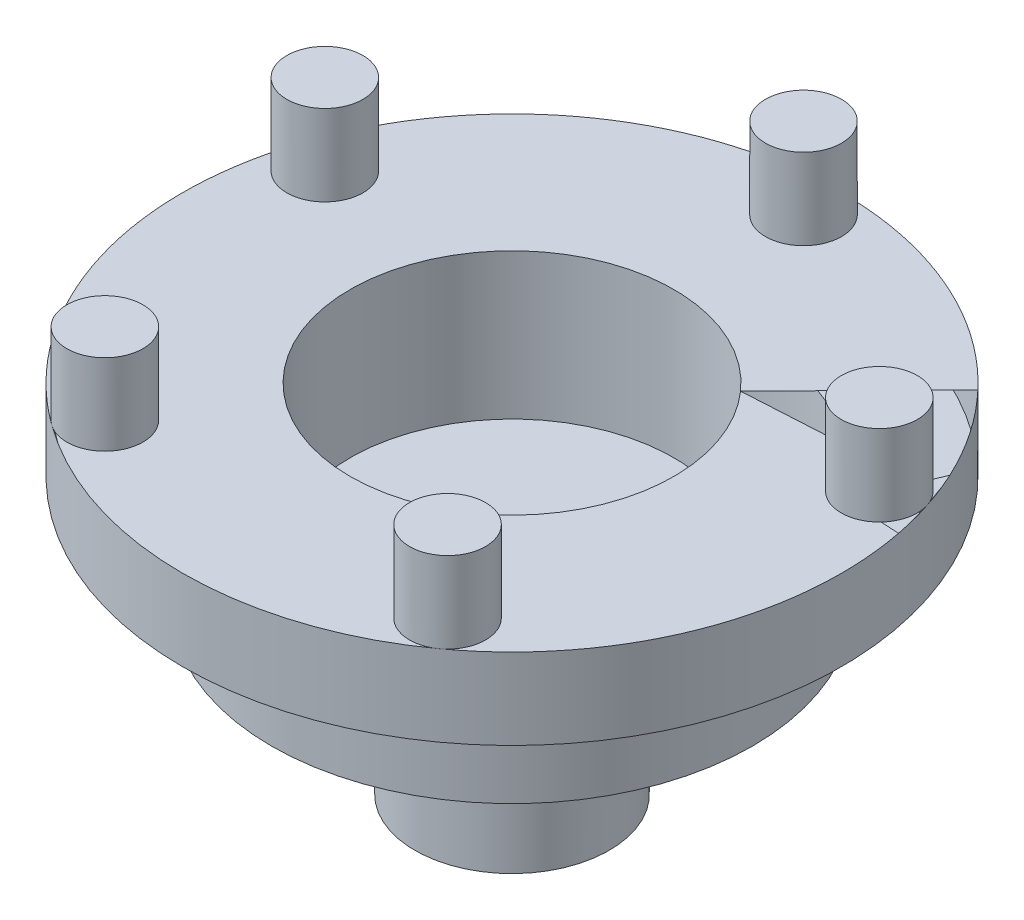
ISO-10303-21;
HEADER;
FILE_DESCRIPTION(('STEP AP214'),'2;1');
FILE_NAME('part.step','',(''),(''),'','','');
FILE_SCHEMA(('AUTOMOTIVE_DESIGN { 1 0 10303 214 1 1 1 1 }'));
ENDSEC;
DATA;
#1=APPLICATION_CONTEXT('core data for automotive mechanical design processes');
#2=APPLICATION_PROTOCOL_DEFINITION('international standard','automotive_design',2000,#1);
#3=PRODUCT_CONTEXT('',#1,'mechanical');
#4=PRODUCT('Part','Part','',(#3));
#5=PRODUCT_RELATED_PRODUCT_CATEGORY('part','',(#4));
#6=PRODUCT_DEFINITION_FORMATION('','',#4);
#7=PRODUCT_DEFINITION_CONTEXT('part definition',#1,'design');
#8=PRODUCT_DEFINITION('design','',#6,#7);
#9=PRODUCT_DEFINITION_SHAPE('','',#8);
#10=(LENGTH_UNIT() NAMED_UNIT(*) SI_UNIT(.MILLI.,.METRE.));
#11=(NAMED_UNIT(*) PLANE_ANGLE_UNIT() SI_UNIT($,.RADIAN.));
#12=(NAMED_UNIT(*) SI_UNIT($,.STERADIAN.) SOLID_ANGLE_UNIT());
#13=UNCERTAINTY_MEASURE_WITH_UNIT(LENGTH_MEASURE(1.E-05),#10,'distance_accuracy_value','');
#14=(GEOMETRIC_REPRESENTATION_CONTEXT(3) GLOBAL_UNCERTAINTY_ASSIGNED_CONTEXT((#13)) GLOBAL_UNIT_ASSIGNED_CONTEXT((#10,
#11,#12)) REPRESENTATION_CONTEXT('',''));
#15=CARTESIAN_POINT('',(0.,0.,0.));
#16=DIRECTION('',(0.,0.,1.));
#17=DIRECTION('',(1.,0.,0.));
#18=AXIS2_PLACEMENT_3D('',#15,#16,#17);
#19=CARTESIAN_POINT('',(0.,5.,0.));
#20=DIRECTION('',(0.,-1.,0.));
#21=DIRECTION('',(0.,0.,-1.));
#22=AXIS2_PLACEMENT_3D('',#19,#20,#21);
#23=CYLINDRICAL_SURFACE('',#22,20.35);
#24=CARTESIAN_POINT('',(0.,0.,0.));
#25=DIRECTION('',(0.,1.,0.));
#26=DIRECTION('',(0.,0.,1.));
#27=AXIS2_PLACEMENT_3D('',#24,#25,#26);
#28=CIRCLE('',#27,20.35);
#29=CARTESIAN_POINT('',(0.,0.,20.35));
#30=VERTEX_POINT('',#29);
#31=EDGE_CURVE('E91',#30,#30,#28,.T.);
#32=ORIENTED_EDGE('',*,*,#31,.T.);
#33=EDGE_LOOP('',(#32));
#34=FACE_BOUND('',#33,.T.);
#35=CARTESIAN_POINT('',(0.,5.,0.));
#36=DIRECTION('',(0.,1.,0.));
#37=DIRECTION('',(0.,0.,1.));
#38=AXIS2_PLACEMENT_3D('',#35,#36,#37);
#39=CIRCLE('',#38,20.35);
#40=CARTESIAN_POINT('',(-19.3540001066066,5.,-6.28849583552961));
#41=VERTEX_POINT('',#40);
#42=CARTESIAN_POINT('',(-11.9614298841506,5.,16.4634958355311));
#43=VERTEX_POINT('',#42);
#44=EDGE_CURVE('E93',#41,#43,#39,.T.);
#45=ORIENTED_EDGE('',*,*,#44,.F.);
#46=CARTESIAN_POINT('',(0.,5.,-20.35));
#47=VERTEX_POINT('',#46);
#48=EDGE_CURVE('E80',#47,#41,#39,.T.);
#49=ORIENTED_EDGE('',*,*,#48,.F.);
#50=CARTESIAN_POINT('',(19.3540001066062,5.,-6.28849583553075));
#51=VERTEX_POINT('',#50);
#52=EDGE_CURVE('E90',#51,#47,#39,.T.);
#53=ORIENTED_EDGE('',*,*,#52,.F.);
#54=CARTESIAN_POINT('',(11.9614298841531,5.,16.4634958355293));
#55=VERTEX_POINT('',#54);
#56=EDGE_CURVE('E487',#55,#51,#39,.T.);
#57=ORIENTED_EDGE('',*,*,#56,.F.);
#58=EDGE_CURVE('E109',#43,#55,#39,.T.);
#59=ORIENTED_EDGE('',*,*,#58,.F.);
#60=EDGE_LOOP('',(#45,#49,#53,#57,#59));
#61=FACE_BOUND('',#60,.T.);
#62=ADVANCED_FACE('F43',(#34,#61),#23,.T.);
#63=CARTESIAN_POINT('',(0.,5.,0.));
#64=DIRECTION('',(0.,1.,0.));
#65=DIRECTION('',(0.,0.,1.));
#66=AXIS2_PLACEMENT_3D('',#63,#64,#65);
#67=PLANE('',#66);
#68=CARTESIAN_POINT('',(0.,5.,0.));
#69=DIRECTION('',(0.,1.,0.));
#70=DIRECTION('',(0.,0.,1.));
#71=AXIS2_PLACEMENT_3D('',#68,#69,#70);
#72=CIRCLE('',#71,10.);
#73=CARTESIAN_POINT('',(0.,5.,10.));
#74=VERTEX_POINT('',#73);
#75=EDGE_CURVE('E142',#74,#74,#72,.T.);
#76=ORIENTED_EDGE('',*,*,#75,.F.);
#77=EDGE_LOOP('',(#76));
#78=FACE_BOUND('',#77,.T.);
#79=ORIENTED_EDGE('',*,*,#52,.T.);
#80=CARTESIAN_POINT('',(0.,5.,-18.));
#81=DIRECTION('',(0.,1.,0.));
#82=DIRECTION('',(0.,0.,1.));
#83=AXIS2_PLACEMENT_3D('',#80,#81,#82);
#84=CIRCLE('',#83,2.35);
#85=EDGE_CURVE('E63',#47,#47,#84,.F.);
#86=ORIENTED_EDGE('',*,*,#85,.T.);
#87=ORIENTED_EDGE('',*,*,#48,.T.);
#88=CARTESIAN_POINT('',(-17.1190172933122,5.,-5.56230589874832));
#89=DIRECTION('',(0.,1.,0.));
#90=DIRECTION('',(0.,0.,1.));
#91=AXIS2_PLACEMENT_3D('',#88,#89,#90);
#92=CIRCLE('',#91,2.35000000000092);
#93=EDGE_CURVE('E85',#41,#41,#92,.F.);
#94=ORIENTED_EDGE('',*,*,#93,.T.);
#95=ORIENTED_EDGE('',*,*,#44,.T.);
#96=CARTESIAN_POINT('',(-10.5801345412631,5.,14.5623058987495));
#97=DIRECTION('',(0.,1.,0.));
#98=DIRECTION('',(0.,0.,1.));
#99=AXIS2_PLACEMENT_3D('',#96,#97,#98);
#100=CIRCLE('',#99,2.3500000000016);
#101=EDGE_CURVE('E105',#43,#43,#100,.F.);
#102=ORIENTED_EDGE('',*,*,#101,.T.);
#103=ORIENTED_EDGE('',*,*,#58,.T.);
#104=CARTESIAN_POINT('',(10.5801345412659,5.,14.5623058987486));
#105=DIRECTION('',(0.,1.,0.));
#106=DIRECTION('',(0.,0.,1.));
#107=AXIS2_PLACEMENT_3D('',#104,#105,#106);
#108=CIRCLE('',#107,2.35000000000129);
#109=EDGE_CURVE('E223',#55,#55,#108,.F.);
#110=ORIENTED_EDGE('',*,*,#109,.T.);
#111=ORIENTED_EDGE('',*,*,#56,.T.);
#112=CARTESIAN_POINT('',(17.1190172933133,5.,-5.56230589874978));
#113=DIRECTION('',(0.,1.,0.));
#114=DIRECTION('',(0.,0.,1.));
#115=AXIS2_PLACEMENT_3D('',#112,#113,#114);
#116=CIRCLE('',#115,2.35000000000034);
#117=EDGE_CURVE('E68',#51,#51,#116,.F.);
#118=ORIENTED_EDGE('',*,*,#117,.T.);
#119=EDGE_LOOP('',(#79,#86,#87,#94,#95,#102,#103,#110,#111,#118));
#120=FACE_BOUND('',#119,.T.);
#121=ADVANCED_FACE('F83',(#78,#120),#67,.T.);
#122=CARTESIAN_POINT('',(0.,0.,0.));
#123=DIRECTION('',(0.,1.,0.));
#124=DIRECTION('',(0.,0.,1.));
#125=AXIS2_PLACEMENT_3D('',#122,#123,#124);
#126=PLANE('',#125);
#127=CARTESIAN_POINT('',(0.,0.,0.));
#128=DIRECTION('',(0.,-1.,0.));
#129=DIRECTION('',(0.,0.,-1.));
#130=AXIS2_PLACEMENT_3D('',#127,#128,#129);
#131=CIRCLE('',#130,14.85);
#132=CARTESIAN_POINT('',(0.,0.,-14.85));
#133=VERTEX_POINT('',#132);
#134=EDGE_CURVE('E57',#133,#133,#131,.T.);
#135=ORIENTED_EDGE('',*,*,#134,.F.);
#136=EDGE_LOOP('',(#135));
#137=FACE_BOUND('',#136,.T.);
#138=ORIENTED_EDGE('',*,*,#31,.F.);
#139=EDGE_LOOP('',(#138));
#140=FACE_BOUND('',#139,.T.);
#141=ADVANCED_FACE('F200',(#137,#140),#126,.F.);
#142=CARTESIAN_POINT('',(-17.1190172933122,10.,-5.56230589874832));
#143=DIRECTION('',(0.,-1.,0.));
#144=DIRECTION('',(0.,0.,-1.));
#145=AXIS2_PLACEMENT_3D('',#142,#143,#144);
#146=CYLINDRICAL_SURFACE('',#145,2.35000000000092);
#147=ORIENTED_EDGE('',*,*,#93,.F.);
#148=EDGE_LOOP('',(#147));
#149=FACE_BOUND('',#148,.T.);
#150=CARTESIAN_POINT('',(-17.1190172933122,10.,-5.56230589874832));
#151=DIRECTION('',(0.,1.,0.));
#152=DIRECTION('',(0.,0.,1.));
#153=AXIS2_PLACEMENT_3D('',#150,#151,#152);
#154=CIRCLE('',#153,2.35000000000092);
#155=CARTESIAN_POINT('',(-17.1190172933122,10.,-3.21230589874741));
#156=VERTEX_POINT('',#155);
#157=EDGE_CURVE('E98',#156,#156,#154,.T.);
#158=ORIENTED_EDGE('',*,*,#157,.F.);
#159=EDGE_LOOP('',(#158));
#160=FACE_BOUND('',#159,.T.);
#161=ADVANCED_FACE('F95',(#149,#160),#146,.T.);
#162=CARTESIAN_POINT('',(0.,10.,0.));
#163=DIRECTION('',(0.,1.,0.));
#164=DIRECTION('',(0.,0.,1.));
#165=AXIS2_PLACEMENT_3D('',#162,#163,#164);
#166=PLANE('',#165);
#167=ORIENTED_EDGE('',*,*,#157,.T.);
#168=EDGE_LOOP('',(#167));
#169=FACE_BOUND('',#168,.T.);
#170=ADVANCED_FACE('F193',(#169),#166,.T.);
#171=CARTESIAN_POINT('',(-10.5801345412631,10.,14.5623058987495));
#172=DIRECTION('',(0.,-1.,0.));
#173=DIRECTION('',(0.,0.,-1.));
#174=AXIS2_PLACEMENT_3D('',#171,#172,#173);
#175=CYLINDRICAL_SURFACE('',#174,2.3500000000016);
#176=ORIENTED_EDGE('',*,*,#101,.F.);
#177=EDGE_LOOP('',(#176));
#178=FACE_BOUND('',#177,.T.);
#179=CARTESIAN_POINT('',(-10.5801345412631,10.,14.5623058987495));
#180=DIRECTION('',(0.,1.,0.));
#181=DIRECTION('',(0.,0.,1.));
#182=AXIS2_PLACEMENT_3D('',#179,#180,#181);
#183=CIRCLE('',#182,2.3500000000016);
#184=CARTESIAN_POINT('',(-10.5801345412631,10.,16.9123058987511));
#185=VERTEX_POINT('',#184);
#186=EDGE_CURVE('E220',#185,#185,#183,.T.);
#187=ORIENTED_EDGE('',*,*,#186,.F.);
#188=EDGE_LOOP('',(#187));
#189=FACE_BOUND('',#188,.T.);
#190=ADVANCED_FACE('F189',(#178,#189),#175,.T.);
#191=CARTESIAN_POINT('',(0.,10.,0.));
#192=DIRECTION('',(0.,1.,0.));
#193=DIRECTION('',(0.,0.,1.));
#194=AXIS2_PLACEMENT_3D('',#191,#192,#193);
#195=PLANE('',#194);
#196=ORIENTED_EDGE('',*,*,#186,.T.);
#197=EDGE_LOOP('',(#196));
#198=FACE_BOUND('',#197,.T.);
#199=ADVANCED_FACE('F185',(#198),#195,.T.);
#200=CARTESIAN_POINT('',(10.5801345412659,10.,14.5623058987486));
#201=DIRECTION('',(0.,-1.,0.));
#202=DIRECTION('',(0.,0.,-1.));
#203=AXIS2_PLACEMENT_3D('',#200,#201,#202);
#204=CYLINDRICAL_SURFACE('',#203,2.35000000000129);
#205=ORIENTED_EDGE('',*,*,#109,.F.);
#206=EDGE_LOOP('',(#205));
#207=FACE_BOUND('',#206,.T.);
#208=CARTESIAN_POINT('',(10.5801345412659,10.,14.5623058987486));
#209=DIRECTION('',(0.,1.,0.));
#210=DIRECTION('',(0.,0.,1.));
#211=AXIS2_PLACEMENT_3D('',#208,#209,#210);
#212=CIRCLE('',#211,2.35000000000129);
#213=CARTESIAN_POINT('',(10.5801345412659,10.,16.9123058987499));
#214=VERTEX_POINT('',#213);
#215=EDGE_CURVE('E228',#214,#214,#212,.T.);
#216=ORIENTED_EDGE('',*,*,#215,.F.);
#217=EDGE_LOOP('',(#216));
#218=FACE_BOUND('',#217,.T.);
#219=ADVANCED_FACE('F181',(#207,#218),#204,.T.);
#220=CARTESIAN_POINT('',(0.,10.,0.));
#221=DIRECTION('',(0.,1.,0.));
#222=DIRECTION('',(0.,0.,1.));
#223=AXIS2_PLACEMENT_3D('',#220,#221,#222);
#224=PLANE('',#223);
#225=ORIENTED_EDGE('',*,*,#215,.T.);
#226=EDGE_LOOP('',(#225));
#227=FACE_BOUND('',#226,.T.);
#228=ADVANCED_FACE('F178',(#227),#224,.T.);
#229=CARTESIAN_POINT('',(17.1190172933133,10.,-5.56230589874978));
#230=DIRECTION('',(0.,-1.,0.));
#231=DIRECTION('',(0.,0.,-1.));
#232=AXIS2_PLACEMENT_3D('',#229,#230,#231);
#233=CYLINDRICAL_SURFACE('',#232,2.35000000000034);
#234=ORIENTED_EDGE('',*,*,#117,.F.);
#235=EDGE_LOOP('',(#234));
#236=FACE_BOUND('',#235,.T.);
#237=CARTESIAN_POINT('',(17.1190172933133,10.,-5.56230589874978));
#238=DIRECTION('',(0.,1.,0.));
#239=DIRECTION('',(0.,0.,1.));
#240=AXIS2_PLACEMENT_3D('',#237,#238,#239);
#241=CIRCLE('',#240,2.35000000000034);
#242=CARTESIAN_POINT('',(17.1190172933133,10.,-3.21230589874944));
#243=VERTEX_POINT('',#242);
#244=EDGE_CURVE('E234',#243,#243,#241,.T.);
#245=ORIENTED_EDGE('',*,*,#244,.F.);
#246=EDGE_LOOP('',(#245));
#247=FACE_BOUND('',#246,.T.);
#248=ADVANCED_FACE('F174',(#236,#247),#233,.T.);
#249=CARTESIAN_POINT('',(0.,10.,0.));
#250=DIRECTION('',(0.,1.,0.));
#251=DIRECTION('',(0.,0.,1.));
#252=AXIS2_PLACEMENT_3D('',#249,#250,#251);
#253=PLANE('',#252);
#254=ORIENTED_EDGE('',*,*,#244,.T.);
#255=EDGE_LOOP('',(#254));
#256=FACE_BOUND('',#255,.T.);
#257=ADVANCED_FACE('F171',(#256),#253,.T.);
#258=CARTESIAN_POINT('',(0.,10.,-18.));
#259=DIRECTION('',(0.,-1.,0.));
#260=DIRECTION('',(0.,0.,-1.));
#261=AXIS2_PLACEMENT_3D('',#258,#259,#260);
#262=CYLINDRICAL_SURFACE('',#261,2.35);
#263=ORIENTED_EDGE('',*,*,#85,.F.);
#264=EDGE_LOOP('',(#263));
#265=FACE_BOUND('',#264,.T.);
#266=CARTESIAN_POINT('',(0.,10.,-18.));
#267=DIRECTION('',(0.,1.,0.));
#268=DIRECTION('',(0.,0.,1.));
#269=AXIS2_PLACEMENT_3D('',#266,#267,#268);
#270=CIRCLE('',#269,2.35);
#271=CARTESIAN_POINT('',(0.,10.,-15.65));
#272=VERTEX_POINT('',#271);
#273=EDGE_CURVE('E240',#272,#272,#270,.T.);
#274=ORIENTED_EDGE('',*,*,#273,.F.);
#275=EDGE_LOOP('',(#274));
#276=FACE_BOUND('',#275,.T.);
#277=ADVANCED_FACE('F167',(#265,#276),#262,.T.);
#278=CARTESIAN_POINT('',(0.,10.,0.));
#279=DIRECTION('',(0.,1.,0.));
#280=DIRECTION('',(0.,0.,1.));
#281=AXIS2_PLACEMENT_3D('',#278,#279,#280);
#282=PLANE('',#281);
#283=ORIENTED_EDGE('',*,*,#273,.T.);
#284=EDGE_LOOP('',(#283));
#285=FACE_BOUND('',#284,.T.);
#286=ADVANCED_FACE('F163',(#285),#282,.T.);
#287=CARTESIAN_POINT('',(0.,-7.,0.));
#288=DIRECTION('',(0.,1.,0.));
#289=DIRECTION('',(0.,0.,1.));
#290=AXIS2_PLACEMENT_3D('',#287,#288,#289);
#291=CYLINDRICAL_SURFACE('',#290,14.85);
#292=CARTESIAN_POINT('',(0.,-7.,0.));
#293=DIRECTION('',(0.,-1.,0.));
#294=DIRECTION('',(0.,0.,-1.));
#295=AXIS2_PLACEMENT_3D('',#292,#293,#294);
#296=CIRCLE('',#295,14.85);
#297=CARTESIAN_POINT('',(0.,-7.,-14.85));
#298=VERTEX_POINT('',#297);
#299=EDGE_CURVE('E244',#298,#298,#296,.T.);
#300=ORIENTED_EDGE('',*,*,#299,.F.);
#301=EDGE_LOOP('',(#300));
#302=FACE_BOUND('',#301,.T.);
#303=ORIENTED_EDGE('',*,*,#134,.T.);
#304=EDGE_LOOP('',(#303));
#305=FACE_BOUND('',#304,.T.);
#306=ADVANCED_FACE('F158',(#302,#305),#291,.T.);
#307=CARTESIAN_POINT('',(0.,-7.,0.));
#308=DIRECTION('',(0.,-1.,0.));
#309=DIRECTION('',(0.,0.,-1.));
#310=AXIS2_PLACEMENT_3D('',#307,#308,#309);
#311=PLANE('',#310);
#312=CARTESIAN_POINT('',(0.,-7.,0.));
#313=DIRECTION('',(0.,-1.,0.));
#314=DIRECTION('',(0.,0.,-1.));
#315=AXIS2_PLACEMENT_3D('',#312,#313,#314);
#316=CIRCLE('',#315,6.);
#317=CARTESIAN_POINT('',(0.,-7.,-6.));
#318=VERTEX_POINT('',#317);
#319=EDGE_CURVE('E252',#318,#318,#316,.T.);
#320=ORIENTED_EDGE('',*,*,#319,.F.);
#321=EDGE_LOOP('',(#320));
#322=FACE_BOUND('',#321,.T.);
#323=ORIENTED_EDGE('',*,*,#299,.T.);
#324=EDGE_LOOP('',(#323));
#325=FACE_BOUND('',#324,.T.);
#326=ADVANCED_FACE('F154',(#322,#325),#311,.T.);
#327=CARTESIAN_POINT('',(0.,-17.,0.));
#328=DIRECTION('',(0.,-1.,0.));
#329=DIRECTION('',(0.,0.,-1.));
#330=AXIS2_PLACEMENT_3D('',#327,#328,#329);
#331=PLANE('',#330);
#332=CARTESIAN_POINT('',(0.,-17.,0.));
#333=DIRECTION('',(0.,-1.,0.));
#334=DIRECTION('',(0.,0.,-1.));
#335=AXIS2_PLACEMENT_3D('',#332,#333,#334);
#336=CIRCLE('',#335,6.);
#337=CARTESIAN_POINT('',(0.,-17.,-6.));
#338=VERTEX_POINT('',#337);
#339=EDGE_CURVE('E251',#338,#338,#336,.T.);
#340=ORIENTED_EDGE('',*,*,#339,.T.);
#341=EDGE_LOOP('',(#340));
#342=FACE_BOUND('',#341,.T.);
#343=CARTESIAN_POINT('',(0.,-17.,0.));
#344=DIRECTION('',(0.,-1.,0.));
#345=DIRECTION('',(0.,0.,-1.));
#346=AXIS2_PLACEMENT_3D('',#343,#344,#345);
#347=CIRCLE('',#346,4.1);
#348=CARTESIAN_POINT('',(0.,-17.,-4.1));
#349=VERTEX_POINT('',#348);
#350=EDGE_CURVE('E256',#349,#349,#347,.T.);
#351=ORIENTED_EDGE('',*,*,#350,.F.);
#352=EDGE_LOOP('',(#351));
#353=FACE_BOUND('',#352,.T.);
#354=ADVANCED_FACE('F152',(#342,#353),#331,.T.);
#355=CARTESIAN_POINT('',(0.,-17.,0.));
#356=DIRECTION('',(0.,1.,0.));
#357=DIRECTION('',(0.,0.,1.));
#358=AXIS2_PLACEMENT_3D('',#355,#356,#357);
#359=CYLINDRICAL_SURFACE('',#358,6.);
#360=CARTESIAN_POINT('',(-5.78273291792039,-11.9417382253448,-1.6));
#361=CARTESIAN_POINT('',(-5.7827344455633,-11.8535974751538,-1.59999787452612));
#362=CARTESIAN_POINT('',(-5.78477011639344,-11.7654342249643,-1.59269194579771));
#363=CARTESIAN_POINT('',(-5.79266848924472,-11.5916538880994,-1.56371666608212));
#364=CARTESIAN_POINT('',(-5.79853311126453,-11.5060381013622,-1.54204010896768));
#365=CARTESIAN_POINT('',(-5.81337900141366,-11.3398917693874,-1.48508676448053));
#366=CARTESIAN_POINT('',(-5.82235588547335,-11.2593542582821,-1.4498291003374));
#367=CARTESIAN_POINT('',(-5.8424092393635,-11.1053248332969,-1.36677427650964));
#368=CARTESIAN_POINT('',(-5.85348587227547,-11.0318334673392,-1.3189761427316));
#369=CARTESIAN_POINT('',(-5.87680111642766,-10.8921441877546,-1.21091878299647));
#370=CARTESIAN_POINT('',(-5.88906032893152,-10.8261486113732,-1.15040238003367));
#371=CARTESIAN_POINT('',(-5.91318161149208,-10.7051129637838,-1.01917941827217));
#372=CARTESIAN_POINT('',(-5.92504364026752,-10.6500740284313,-0.948471804277316));
#373=CARTESIAN_POINT('',(-5.94726390774734,-10.5516702746224,-0.797470536698616));
#374=CARTESIAN_POINT('',(-5.95759501009834,-10.5085066104385,-0.717041455903584));
#375=CARTESIAN_POINT('',(-5.97535300969467,-10.436390517051,-0.549746435783273));
#376=CARTESIAN_POINT('',(-5.9827803966101,-10.4074356915195,-0.462881584700083));
#377=CARTESIAN_POINT('',(-5.99374842861169,-10.3652140491562,-0.287292769448072));
#378=CARTESIAN_POINT('',(-5.99737421400212,-10.351603044044,-0.198656979360733));
#379=CARTESIAN_POINT('',(-6.000628196942,-10.339372529259,-0.0202908428068609));
#380=CARTESIAN_POINT('',(-6.00025706357286,-10.3407505104407,0.0694393179508234));
#381=CARTESIAN_POINT('',(-5.99562140687813,-10.3582164753764,0.245051389689077));
#382=CARTESIAN_POINT('',(-5.99145531221602,-10.3739325914538,0.330973280576888));
#383=CARTESIAN_POINT('',(-5.97981398872374,-10.4190279355703,0.498913052456844));
#384=CARTESIAN_POINT('',(-5.97233857120463,-10.4484079426936,0.580930710544464));
#385=CARTESIAN_POINT('',(-5.95477255279922,-10.5202821034187,0.739683156118043));
#386=CARTESIAN_POINT('',(-5.94465670302171,-10.5629036710253,0.816357349063632));
#387=CARTESIAN_POINT('',(-5.9228997480757,-10.6599532809521,0.961591999011612));
#388=CARTESIAN_POINT('',(-5.91125834578275,-10.7143836245673,1.03015087046869));
#389=CARTESIAN_POINT('',(-5.88729018351104,-10.8354797116919,1.15942829557249));
#390=CARTESIAN_POINT('',(-5.87495335495478,-10.9024697813843,1.21984153614219));
#391=CARTESIAN_POINT('',(-5.85130724018329,-11.0457579663358,1.32865065683815));
#392=CARTESIAN_POINT('',(-5.83999801664631,-11.122056648705,1.37704580423844));
#393=CARTESIAN_POINT('',(-5.81964721826454,-11.2824583068019,1.46067743349021));
#394=CARTESIAN_POINT('',(-5.81062005680583,-11.3666065060757,1.49583093280429));
#395=CARTESIAN_POINT('',(-5.79603460063156,-11.5399194249083,1.55139201348531));
#396=CARTESIAN_POINT('',(-5.79047544571885,-11.6290828945035,1.57180325169042));
#397=CARTESIAN_POINT('',(-5.78363868515234,-11.8070399941621,1.59677405674218));
#398=CARTESIAN_POINT('',(-5.78223810662157,-11.8957650642334,1.60178906096974));
#399=CARTESIAN_POINT('',(-5.78354062803713,-12.0727860435868,1.597079848984));
#400=CARTESIAN_POINT('',(-5.78624329125356,-12.1610819975385,1.58735720137773));
#401=CARTESIAN_POINT('',(-5.79532899431386,-12.3329835006229,1.55385017495931));
#402=CARTESIAN_POINT('',(-5.80164031753083,-12.4166465756959,1.53033958330325));
#403=CARTESIAN_POINT('',(-5.81716215168585,-12.5788419304314,1.47023189380392));
#404=CARTESIAN_POINT('',(-5.82637304120572,-12.6573735384864,1.43363308701324));
#405=CARTESIAN_POINT('',(-5.84690857976629,-12.8089821912933,1.34746324406962));
#406=CARTESIAN_POINT('',(-5.8582752389782,-12.8819014060567,1.29762476190339));
#407=CARTESIAN_POINT('',(-5.88174273547405,-13.0185088667072,1.18672182390013));
#408=CARTESIAN_POINT('',(-5.89384371048319,-13.0821953733081,1.12565525778373));
#409=CARTESIAN_POINT('',(-5.91783971907433,-13.2004202039447,0.991923026003871));
#410=CARTESIAN_POINT('',(-5.92971869219044,-13.2546409269277,0.918973132807077));
#411=CARTESIAN_POINT('',(-5.95157336013737,-13.3500670152732,0.764742748752596));
#412=CARTESIAN_POINT('',(-5.96154915626333,-13.3912730734079,0.683462701615108));
#413=CARTESIAN_POINT('',(-5.978409207194,-13.459121931234,0.515451307860698));
#414=CARTESIAN_POINT('',(-5.98531646784308,-13.4858734408996,0.428766282305869));
#415=CARTESIAN_POINT('',(-5.99536243029798,-13.5243692077963,0.251919507785058));
#416=CARTESIAN_POINT('',(-5.99850196723977,-13.5361167907645,0.1617585338562));
#417=CARTESIAN_POINT('',(-6.0006193075016,-13.5440628843379,-0.0165136010769243));
#418=CARTESIAN_POINT('',(-5.99972181030494,-13.5407272806497,-0.104602809222309));
#419=CARTESIAN_POINT('',(-5.9941479278306,-13.5196834304846,-0.278918643704556));
#420=CARTESIAN_POINT('',(-5.98947168443723,-13.5019757236512,-0.365145339850183));
#421=CARTESIAN_POINT('',(-5.97689048312844,-13.4529537414098,-0.532728098771435));
#422=CARTESIAN_POINT('',(-5.96900797751776,-13.4217339905665,-0.614113609481483));
#423=CARTESIAN_POINT('',(-5.95083853212803,-13.3466585439482,-0.770537678776833));
#424=CARTESIAN_POINT('',(-5.9405512551794,-13.3028010760559,-0.845575345328785));
#425=CARTESIAN_POINT('',(-5.91833064980799,-13.2023316076337,-0.989342614939896));
#426=CARTESIAN_POINT('',(-5.90636074702983,-13.1454107207804,-1.05785068939027));
#427=CARTESIAN_POINT('',(-5.88227200056129,-13.0210160258583,-1.18450029724544));
#428=CARTESIAN_POINT('',(-5.87015311850574,-12.9535394447097,-1.24263909793084));
#429=CARTESIAN_POINT('',(-5.84683167732792,-12.8081635086723,-1.34816560187261));
#430=CARTESIAN_POINT('',(-5.83565513061492,-12.7300675743456,-1.39528875413901));
#431=CARTESIAN_POINT('',(-5.81585115203583,-12.5667731765823,-1.47566951228968));
#432=CARTESIAN_POINT('',(-5.80722205399804,-12.481579402493,-1.50893618695116));
#433=CARTESIAN_POINT('',(-5.79468800506476,-12.3208731565176,-1.55630499401031));
#434=CARTESIAN_POINT('',(-5.79024112213281,-12.2460572137031,-1.57265214719335));
#435=CARTESIAN_POINT('',(-5.78426308173731,-12.0947457789459,-1.59449995435361));
#436=CARTESIAN_POINT('',(-5.7827315918209,-12.0182504795127,-1.60000184505801));
#437=CARTESIAN_POINT('',(-5.78273291792039,-11.9417382253448,-1.6));
#438=B_SPLINE_CURVE_WITH_KNOTS('',3,(#360,#361,#362,#363,#364,#365,#366,#367,#368,#369,#370,
#371,#372,#373,#374,#375,#376,#377,#378,#379,#380,#381,#382,#383,#384,#385,#386,#387,#388,#389,
#390,#391,#392,#393,#394,#395,#396,#397,#398,#399,#400,#401,#402,#403,#404,#405,#406,#407,#408,
#409,#410,#411,#412,#413,#414,#415,#416,#417,#418,#419,#420,#421,#422,#423,#424,#425,#426,#427,
#428,#429,#430,#431,#432,#433,#434,#435,#436,#437),.UNSPECIFIED.,.T.,.F.,(4,2,2,2,2,2,2,2,2,2,2,
2,2,2,2,2,2,2,2,2,2,2,2,2,2,2,2,2,2,2,2,2,2,2,2,2,2,2,4),(0.,0.26414090249282,0.528414358280161,
0.792317049276935,1.05624024524884,1.32612732904169,1.59604237699569,1.87028165896643,
2.14447467443397,2.41238643453184,2.68025334708482,2.94136456640643,3.20249067552556,
3.46621159124456,3.72998394715593,4.00185409840264,4.27374082111663,4.54730412077229,
4.82079953934806,5.08612267391536,5.35141757070659,5.61161480341915,5.87184602287715,
6.13779707970074,6.40379817229035,6.67748725563562,6.95116176802338,7.22274831668976,
7.4942746556306,7.75747243929026,8.02066034086225,8.28203611890788,8.54344856608626,
8.81183083189117,9.08028372300694,9.35464031183427,9.62881705674851,9.8581357413103,
10.0874282742632),.UNSPECIFIED.);
#439=CARTESIAN_POINT('',(-5.78273291792039,-11.9417382253448,-1.6));
#440=VERTEX_POINT('',#439);
#441=EDGE_CURVE('E141',#440,#440,#438,.T.);
#442=ORIENTED_EDGE('',*,*,#441,.T.);
#443=EDGE_LOOP('',(#442));
#444=FACE_BOUND('',#443,.T.);
#445=CARTESIAN_POINT('',(5.78273291792039,-11.9417382253448,-1.6));
#446=CARTESIAN_POINT('',(5.7827344455633,-12.0298789755358,-1.59999787452612));
#447=CARTESIAN_POINT('',(5.78477011639344,-12.1180422257253,-1.59269194579771));
#448=CARTESIAN_POINT('',(5.79266848924472,-12.2918225625902,-1.56371666608212));
#449=CARTESIAN_POINT('',(5.79853311126453,-12.3774383493273,-1.54204010896768));
#450=CARTESIAN_POINT('',(5.81337900141366,-12.5435846813021,-1.48508676448053));
#451=CARTESIAN_POINT('',(5.82235588547335,-12.6241221924075,-1.4498291003374));
#452=CARTESIAN_POINT('',(5.8424092393635,-12.7781516173927,-1.36677427650964));
#453=CARTESIAN_POINT('',(5.85348587227547,-12.8516429833504,-1.3189761427316));
#454=CARTESIAN_POINT('',(5.87680111642766,-12.991332262935,-1.21091878299647));
#455=CARTESIAN_POINT('',(5.88906032893152,-13.0573278393163,-1.15040238003367));
#456=CARTESIAN_POINT('',(5.91318161149208,-13.1783634869057,-1.01917941827217));
#457=CARTESIAN_POINT('',(5.92504364026752,-13.2334024222582,-0.948471804277316));
#458=CARTESIAN_POINT('',(5.94726390774734,-13.3318061760671,-0.797470536698616));
#459=CARTESIAN_POINT('',(5.95759501009834,-13.3749698402511,-0.717041455903584));
#460=CARTESIAN_POINT('',(5.97535300969467,-13.4470859336386,-0.549746435783273));
#461=CARTESIAN_POINT('',(5.9827803966101,-13.47604075917,-0.462881584700083));
#462=CARTESIAN_POINT('',(5.99374842861169,-13.5182624015334,-0.287292769448072));
#463=CARTESIAN_POINT('',(5.99737421400212,-13.5318734066455,-0.198656979360733));
#464=CARTESIAN_POINT('',(6.000628196942,-13.5441039214305,-0.0202908428068607));
#465=CARTESIAN_POINT('',(6.00025706357286,-13.5427259402489,0.0694393179508235));
#466=CARTESIAN_POINT('',(5.99562140687813,-13.5252599753132,0.245051389689077));
#467=CARTESIAN_POINT('',(5.99145531221602,-13.5095438592358,0.330973280576888));
#468=CARTESIAN_POINT('',(5.97981398872374,-13.4644485151192,0.498913052456844));
#469=CARTESIAN_POINT('',(5.97233857120463,-13.4350685079959,0.580930710544464));
#470=CARTESIAN_POINT('',(5.95477255279922,-13.3631943472709,0.739683156118043));
#471=CARTESIAN_POINT('',(5.94465670302171,-13.3205727796642,0.816357349063632));
#472=CARTESIAN_POINT('',(5.9228997480757,-13.2235231697375,0.961591999011612));
#473=CARTESIAN_POINT('',(5.91125834578275,-13.1690928261222,1.03015087046869));
#474=CARTESIAN_POINT('',(5.88729018351104,-13.0479967389976,1.15942829557249));
#475=CARTESIAN_POINT('',(5.87495335495478,-12.9810066693053,1.21984153614219));
#476=CARTESIAN_POINT('',(5.85130724018329,-12.8377184843538,1.32865065683815));
#477=CARTESIAN_POINT('',(5.83999801664631,-12.7614198019845,1.37704580423844));
#478=CARTESIAN_POINT('',(5.81964721826454,-12.6010181438876,1.46067743349021));
#479=CARTESIAN_POINT('',(5.81062005680583,-12.5168699446138,1.49583093280429));
#480=CARTESIAN_POINT('',(5.79603460063156,-12.3435570257812,1.55139201348531));
#481=CARTESIAN_POINT('',(5.79047544571885,-12.254393556186,1.57180325169042));
#482=CARTESIAN_POINT('',(5.78363868515234,-12.0764364565275,1.59677405674218));
#483=CARTESIAN_POINT('',(5.78223810662157,-11.9877113864562,1.60178906096974));
#484=CARTESIAN_POINT('',(5.78354062803713,-11.8106904071028,1.597079848984));
#485=CARTESIAN_POINT('',(5.78624329125356,-11.722394453151,1.58735720137773));
#486=CARTESIAN_POINT('',(5.79532899431386,-11.5504929500667,1.55385017495931));
#487=CARTESIAN_POINT('',(5.80164031753083,-11.4668298749937,1.53033958330325));
#488=CARTESIAN_POINT('',(5.81716215168585,-11.3046345202581,1.47023189380392));
#489=CARTESIAN_POINT('',(5.82637304120572,-11.2261029122032,1.43363308701324));
#490=CARTESIAN_POINT('',(5.84690857976629,-11.0744942593963,1.34746324406962));
#491=CARTESIAN_POINT('',(5.8582752389782,-11.0015750446329,1.29762476190339));
#492=CARTESIAN_POINT('',(5.88174273547405,-10.8649675839824,1.18672182390013));
#493=CARTESIAN_POINT('',(5.89384371048319,-10.8012810773815,1.12565525778373));
#494=CARTESIAN_POINT('',(5.91783971907433,-10.6830562467448,0.991923026003871));
#495=CARTESIAN_POINT('',(5.92971869219044,-10.6288355237619,0.918973132807077));
#496=CARTESIAN_POINT('',(5.95157336013737,-10.5334094354164,0.764742748752596));
#497=CARTESIAN_POINT('',(5.96154915626333,-10.4922033772816,0.683462701615108));
#498=CARTESIAN_POINT('',(5.978409207194,-10.4243545194556,0.515451307860698));
#499=CARTESIAN_POINT('',(5.98531646784308,-10.39760300979,0.428766282305869));
#500=CARTESIAN_POINT('',(5.99536243029798,-10.3591072428933,0.251919507785058));
#501=CARTESIAN_POINT('',(5.99850196723977,-10.347359659925,0.1617585338562));
#502=CARTESIAN_POINT('',(6.0006193075016,-10.3394135663516,-0.0165136010769243));
#503=CARTESIAN_POINT('',(5.99972181030494,-10.3427491700399,-0.104602809222309));
#504=CARTESIAN_POINT('',(5.9941479278306,-10.3637930202049,-0.278918643704556));
#505=CARTESIAN_POINT('',(5.98947168443723,-10.3815007270383,-0.365145339850183));
#506=CARTESIAN_POINT('',(5.97689048312844,-10.4305227092798,-0.532728098771435));
#507=CARTESIAN_POINT('',(5.96900797751776,-10.4617424601231,-0.614113609481483));
#508=CARTESIAN_POINT('',(5.95083853212803,-10.5368179067414,-0.770537678776833));
#509=CARTESIAN_POINT('',(5.9405512551794,-10.5806753746336,-0.845575345328785));
#510=CARTESIAN_POINT('',(5.91833064980799,-10.6811448430558,-0.989342614939896));
#511=CARTESIAN_POINT('',(5.90636074702983,-10.7380657299092,-1.05785068939027));
#512=CARTESIAN_POINT('',(5.88227200056129,-10.8624604248313,-1.18450029724544));
#513=CARTESIAN_POINT('',(5.87015311850574,-10.9299370059799,-1.24263909793084));
#514=CARTESIAN_POINT('',(5.84683167732792,-11.0753129420173,-1.34816560187261));
#515=CARTESIAN_POINT('',(5.83565513061492,-11.153408876344,-1.39528875413901));
#516=CARTESIAN_POINT('',(5.81585115203583,-11.3167032741073,-1.47566951228968));
#517=CARTESIAN_POINT('',(5.80722205399804,-11.4018970481966,-1.50893618695116));
#518=CARTESIAN_POINT('',(5.79468800506476,-11.562603294172,-1.55630499401031));
#519=CARTESIAN_POINT('',(5.79024112213281,-11.6374192369864,-1.57265214719335));
#520=CARTESIAN_POINT('',(5.78426308173731,-11.7887306717437,-1.59449995435361));
#521=CARTESIAN_POINT('',(5.7827315918209,-11.8652259711769,-1.60000184505801));
#522=CARTESIAN_POINT('',(5.78273291792039,-11.9417382253448,-1.6));
#523=B_SPLINE_CURVE_WITH_KNOTS('',3,(#445,#446,#447,#448,#449,#450,#451,#452,#453,#454,#455,
#456,#457,#458,#459,#460,#461,#462,#463,#464,#465,#466,#467,#468,#469,#470,#471,#472,#473,#474,
#475,#476,#477,#478,#479,#480,#481,#482,#483,#484,#485,#486,#487,#488,#489,#490,#491,#492,#493,
#494,#495,#496,#497,#498,#499,#500,#501,#502,#503,#504,#505,#506,#507,#508,#509,#510,#511,#512,
#513,#514,#515,#516,#517,#518,#519,#520,#521,#522),.UNSPECIFIED.,.T.,.F.,(4,2,2,2,2,2,2,2,2,2,2,
2,2,2,2,2,2,2,2,2,2,2,2,2,2,2,2,2,2,2,2,2,2,2,2,2,2,2,4),(0.,0.26414090249282,0.528414358280161,
0.792317049276933,1.05624024524884,1.32612732904169,1.59604237699569,1.87028165896643,
2.14447467443397,2.41238643453184,2.68025334708482,2.94136456640643,3.20249067552556,
3.46621159124456,3.72998394715593,4.00185409840264,4.27374082111663,4.54730412077229,
4.82079953934806,5.08612267391536,5.35141757070658,5.61161480341915,5.87184602287714,
6.13779707970073,6.40379817229035,6.67748725563562,6.95116176802338,7.22274831668976,
7.4942746556306,7.75747243929026,8.02066034086225,8.28203611890788,8.54344856608626,
8.81183083189117,9.08028372300694,9.35464031183427,9.6288170567485,9.85813574131029,
10.0874282742632),.UNSPECIFIED.);
#524=CARTESIAN_POINT('',(5.78273291792039,-11.9417382253448,-1.6));
#525=VERTEX_POINT('',#524);
#526=EDGE_CURVE('E133',#525,#525,#523,.T.);
#527=ORIENTED_EDGE('',*,*,#526,.T.);
#528=EDGE_LOOP('',(#527));
#529=FACE_BOUND('',#528,.T.);
#530=ORIENTED_EDGE('',*,*,#339,.F.);
#531=EDGE_LOOP('',(#530));
#532=FACE_BOUND('',#531,.T.);
#533=ORIENTED_EDGE('',*,*,#319,.T.);
#534=EDGE_LOOP('',(#533));
#535=FACE_BOUND('',#534,.T.);
#536=ADVANCED_FACE('F148',(#444,#529,#532,#535),#359,.T.);
#537=CARTESIAN_POINT('',(0.,-17.,0.));
#538=DIRECTION('',(0.,1.,0.));
#539=DIRECTION('',(0.,0.,1.));
#540=AXIS2_PLACEMENT_3D('',#537,#538,#539);
#541=CYLINDRICAL_SURFACE('',#540,4.1);
#542=CARTESIAN_POINT('',(-3.77491721763537,-11.9417382253448,-1.6));
#543=CARTESIAN_POINT('',(-3.77491270178866,-11.855625568362,-1.60000463009787));
#544=CARTESIAN_POINT('',(-3.77789563293731,-11.7695418397017,-1.59302519025978));
#545=CARTESIAN_POINT('',(-3.78941184341538,-11.5999867360308,-1.5654329117999));
#546=CARTESIAN_POINT('',(-3.79794462177339,-11.5165151259432,-1.54482130371844));
#547=CARTESIAN_POINT('',(-3.81944987613332,-11.3546872048883,-1.49085014114927));
#548=CARTESIAN_POINT('',(-3.83241090243314,-11.2763183163581,-1.45752343720446));
#549=CARTESIAN_POINT('',(-3.86129308469316,-11.1262526526136,-1.3791857402288));
#550=CARTESIAN_POINT('',(-3.87721520204421,-11.0545580557484,-1.33417095048832));
#551=CARTESIAN_POINT('',(-3.91118698664532,-10.9160097222606,-1.23113555349346));
#552=CARTESIAN_POINT('',(-3.92930270646765,-10.849565989582,-1.17258526178294));
#553=CARTESIAN_POINT('',(-3.96507204519568,-10.7271480715597,-1.04526218092767));
#554=CARTESIAN_POINT('',(-3.9827255538325,-10.6711763652839,-0.97648697811328));
#555=CARTESIAN_POINT('',(-4.01637475548721,-10.5692697779335,-0.827508960823093));
#556=CARTESIAN_POINT('',(-4.03228409383461,-10.5237869378605,-0.746975673733203));
#557=CARTESIAN_POINT('',(-4.05985198959331,-10.4471877727662,-0.578668931991276));
#558=CARTESIAN_POINT('',(-4.0715121533502,-10.416066017535,-0.49089822877056));
#559=CARTESIAN_POINT('',(-4.08879848858447,-10.3705296275999,-0.314923010370836));
#560=CARTESIAN_POINT('',(-4.09467920045392,-10.3554077156264,-0.226927014493084));
#561=CARTESIAN_POINT('',(-4.10066146521575,-10.3400272322646,-0.0494628931077122));
#562=CARTESIAN_POINT('',(-4.10076505377334,-10.3397634253763,0.0400047027414219));
#563=CARTESIAN_POINT('',(-4.09533905758318,-10.3537093676515,0.212777226734447));
#564=CARTESIAN_POINT('',(-4.09011059874924,-10.3671454142462,0.296155750070469));
#565=CARTESIAN_POINT('',(-4.07500954360984,-10.4067994096064,0.459365965049175));
#566=CARTESIAN_POINT('',(-4.06513661599445,-10.4330182702297,0.539197403218317));
#567=CARTESIAN_POINT('',(-4.04153205939897,-10.4978191712235,0.694465643691002));
#568=CARTESIAN_POINT('',(-4.02774512124438,-10.5365796229596,0.769819230355895));
#569=CARTESIAN_POINT('',(-3.99769148834298,-10.6252001560878,0.9131445931619));
#570=CARTESIAN_POINT('',(-3.9814239610799,-10.6750639664994,0.981113877876523));
#571=CARTESIAN_POINT('',(-3.94686365192419,-10.7881325783581,1.11227401605788));
#572=CARTESIAN_POINT('',(-3.92850784146324,-10.8519788783418,1.17489608560015));
#573=CARTESIAN_POINT('',(-3.89263969823368,-10.9893543763285,1.28877011915449));
#574=CARTESIAN_POINT('',(-3.8751276161272,-11.0628864279259,1.34001872034739));
#575=CARTESIAN_POINT('',(-3.84251335704748,-11.2199697204196,1.43090526339579));
#576=CARTESIAN_POINT('',(-3.82748488958517,-11.3037302797117,1.47021006538132));
#577=CARTESIAN_POINT('',(-3.80239812758812,-11.4774236877716,1.53393459785456));
#578=CARTESIAN_POINT('',(-3.79233679054888,-11.5673527196318,1.55836344242347));
#579=CARTESIAN_POINT('',(-3.77905362015354,-11.7451755814181,1.59029469368309));
#580=CARTESIAN_POINT('',(-3.7754643635647,-11.8328780861866,1.59870803014786));
#581=CARTESIAN_POINT('',(-3.77448746436832,-12.008496005075,1.60101498820542));
#582=CARTESIAN_POINT('',(-3.77709807861056,-12.0964113524095,1.59491269100023));
#583=CARTESIAN_POINT('',(-3.78785120860413,-12.2650575208871,1.56918971915939));
#584=CARTESIAN_POINT('',(-3.79569262460405,-12.3459219552799,1.55030406394656));
#585=CARTESIAN_POINT('',(-3.81565680287088,-12.5032874309601,1.50049253673583));
#586=CARTESIAN_POINT('',(-3.82778048589846,-12.5797875297285,1.469564075182));
#587=CARTESIAN_POINT('',(-3.85552893014613,-12.7296104949925,1.39517993640678));
#588=CARTESIAN_POINT('',(-3.87127282021807,-12.8026893986452,1.3512786724721));
#589=CARTESIAN_POINT('',(-3.90429882862551,-12.9407640608519,1.25265787261705));
#590=CARTESIAN_POINT('',(-3.92158154752966,-13.0057566395705,1.1979341026629));
#591=CARTESIAN_POINT('',(-3.95719206099394,-13.1305159333402,1.07471721592028));
#592=CARTESIAN_POINT('',(-3.97550879212029,-13.1896032504208,1.00553048005675));
#593=CARTESIAN_POINT('',(-4.00998251904988,-13.295424945114,0.857780690647456));
#594=CARTESIAN_POINT('',(-4.02613946121794,-13.3421590159799,0.779217404340572));
#595=CARTESIAN_POINT('',(-4.05449765841259,-13.421716061539,0.614806909452876));
#596=CARTESIAN_POINT('',(-4.06670531460669,-13.4545615741956,0.528971775300454));
#597=CARTESIAN_POINT('',(-4.08578979986559,-13.5051425309666,0.352404097036825));
#598=CARTESIAN_POINT('',(-4.09266936942218,-13.5228857433876,0.261674096313902));
#599=CARTESIAN_POINT('',(-4.10004300167386,-13.5418698112444,0.084007841933822));
#600=CARTESIAN_POINT('',(-4.10090938604612,-13.544073015196,-0.00281096910792478));
#601=CARTESIAN_POINT('',(-4.09715092918434,-13.5344297158004,-0.175534394927551));
#602=CARTESIAN_POINT('',(-4.09252684626638,-13.5225851526612,-0.261439134299242));
#603=CARTESIAN_POINT('',(-4.07848712873686,-13.4858664808615,-0.427426379542112));
#604=CARTESIAN_POINT('',(-4.0692099838123,-13.4613683860281,-0.50760469735893));
#605=CARTESIAN_POINT('',(-4.04684633115084,-13.4004247211426,-0.662707182119042));
#606=CARTESIAN_POINT('',(-4.03375910319766,-13.3639768920794,-0.737630352361073));
#607=CARTESIAN_POINT('',(-4.00436248613814,-13.2783763936816,-0.883669016650168));
#608=CARTESIAN_POINT('',(-3.98793779086962,-13.2287404601711,-0.95447756671227));
#609=CARTESIAN_POINT('',(-3.95386113152062,-13.1189133627094,-1.08704879427954));
#610=CARTESIAN_POINT('',(-3.93620871826607,-13.058718323203,-1.14880813508559));
#611=CARTESIAN_POINT('',(-3.90039570662005,-12.9253250046401,-1.26524310794518));
#612=CARTESIAN_POINT('',(-3.88226534365481,-12.8515737590536,-1.31929710057992));
#613=CARTESIAN_POINT('',(-3.84867621033566,-12.6954703328065,-1.41429809702327));
#614=CARTESIAN_POINT('',(-3.83321816398514,-12.6131158309541,-1.45524155138235));
#615=CARTESIAN_POINT('',(-3.80592411348375,-12.4350646995209,-1.52528126646523));
#616=CARTESIAN_POINT('',(-3.794474927858,-12.3388278273076,-1.5531733777011));
#617=CARTESIAN_POINT('',(-3.77897717552243,-12.1422913493507,-1.59052240946245));
#618=CARTESIAN_POINT('',(-3.77492247522539,-12.041995181379,-1.59999460939268));
#619=CARTESIAN_POINT('',(-3.77491721763537,-11.9417382253448,-1.6));
#620=B_SPLINE_CURVE_WITH_KNOTS('',3,(#542,#543,#544,#545,#546,#547,#548,#549,#550,#551,#552,
#553,#554,#555,#556,#557,#558,#559,#560,#561,#562,#563,#564,#565,#566,#567,#568,#569,#570,#571,
#572,#573,#574,#575,#576,#577,#578,#579,#580,#581,#582,#583,#584,#585,#586,#587,#588,#589,#590,
#591,#592,#593,#594,#595,#596,#597,#598,#599,#600,#601,#602,#603,#604,#605,#606,#607,#608,#609,
#610,#611,#612,#613,#614,#615,#616,#617,#618,#619),.UNSPECIFIED.,.T.,.F.,(4,2,2,2,2,2,2,2,2,2,2,
2,2,2,2,2,2,2,2,2,2,2,2,2,2,2,2,2,2,2,2,2,2,2,2,2,2,2,4),(0.,0.257963874268117,0.51590446598656,
0.773183109938942,1.0305454320089,1.30053288313627,1.57058416838919,1.85070446248834,
2.13071875060327,2.39775920182434,2.6647055563187,2.91736801889893,3.17004850771309,
3.42649439040806,3.68302652969938,3.9556811847774,4.22841634918732,4.50817797257154,
4.7877680209647,5.05091585694027,5.31398971526122,5.56309458414791,5.81225304748122,
6.07122900920907,6.3303064899272,6.60743106857401,6.88456252792309,7.16124252394343,
7.43778011541847,7.69702906173051,7.95624220603041,8.20816141068722,8.46012826633954,
8.72304437148122,8.98605717856633,9.26438053473506,9.54277917851351,9.8433639463168,
10.1436992710771),.UNSPECIFIED.);
#621=CARTESIAN_POINT('',(-3.77491721763537,-11.9417382253448,-1.6));
#622=VERTEX_POINT('',#621);
#623=EDGE_CURVE('E46',#622,#622,#620,.T.);
#624=ORIENTED_EDGE('',*,*,#623,.F.);
#625=EDGE_LOOP('',(#624));
#626=FACE_BOUND('',#625,.T.);
#627=CARTESIAN_POINT('',(3.77491721763537,-11.9417382253448,-1.6));
#628=CARTESIAN_POINT('',(3.77491270178866,-12.0278508823276,-1.60000463009787));
#629=CARTESIAN_POINT('',(3.77789563293731,-12.1139346109879,-1.59302519025978));
#630=CARTESIAN_POINT('',(3.78941184341538,-12.2834897146588,-1.5654329117999));
#631=CARTESIAN_POINT('',(3.79794462177339,-12.3669613247464,-1.54482130371844));
#632=CARTESIAN_POINT('',(3.81944987613332,-12.5287892458013,-1.49085014114927));
#633=CARTESIAN_POINT('',(3.83241090243314,-12.6071581343314,-1.45752343720446));
#634=CARTESIAN_POINT('',(3.86129308469316,-12.757223798076,-1.3791857402288));
#635=CARTESIAN_POINT('',(3.87721520204421,-12.8289183949411,-1.33417095048832));
#636=CARTESIAN_POINT('',(3.91118698664532,-12.967466728429,-1.23113555349346));
#637=CARTESIAN_POINT('',(3.92930270646765,-13.0339104611076,-1.17258526178294));
#638=CARTESIAN_POINT('',(3.96507204519568,-13.1563283791299,-1.04526218092767));
#639=CARTESIAN_POINT('',(3.9827255538325,-13.2123000854057,-0.97648697811328));
#640=CARTESIAN_POINT('',(4.01637475548721,-13.314206672756,-0.827508960823093));
#641=CARTESIAN_POINT('',(4.03228409383461,-13.3596895128291,-0.746975673733203));
#642=CARTESIAN_POINT('',(4.05985198959331,-13.4362886779234,-0.578668931991276));
#643=CARTESIAN_POINT('',(4.0715121533502,-13.4674104331546,-0.49089822877056));
#644=CARTESIAN_POINT('',(4.08879848858447,-13.5129468230897,-0.314923010370836));
#645=CARTESIAN_POINT('',(4.09467920045392,-13.5280687350632,-0.226927014493084));
#646=CARTESIAN_POINT('',(4.10066146521575,-13.5434492184249,-0.0494628931077122));
#647=CARTESIAN_POINT('',(4.10076505377334,-13.5437130253133,0.0400047027414219));
#648=CARTESIAN_POINT('',(4.09533905758318,-13.5297670830381,0.212777226734447));
#649=CARTESIAN_POINT('',(4.09011059874924,-13.5163310364433,0.296155750070469));
#650=CARTESIAN_POINT('',(4.07500954360984,-13.4766770410832,0.459365965049175));
#651=CARTESIAN_POINT('',(4.06513661599445,-13.4504581804598,0.539197403218317));
#652=CARTESIAN_POINT('',(4.04153205939897,-13.3856572794661,0.694465643691002));
#653=CARTESIAN_POINT('',(4.02774512124438,-13.3468968277299,0.769819230355895));
#654=CARTESIAN_POINT('',(3.99769148834298,-13.2582762946018,0.9131445931619));
#655=CARTESIAN_POINT('',(3.9814239610799,-13.2084124841902,0.981113877876523));
#656=CARTESIAN_POINT('',(3.94686365192419,-13.0953438723315,1.11227401605788));
#657=CARTESIAN_POINT('',(3.92850784146324,-13.0314975723477,1.17489608560015));
#658=CARTESIAN_POINT('',(3.89263969823368,-12.8941220743611,1.28877011915449));
#659=CARTESIAN_POINT('',(3.8751276161272,-12.8205900227637,1.34001872034739));
#660=CARTESIAN_POINT('',(3.84251335704748,-12.66350673027,1.43090526339579));
#661=CARTESIAN_POINT('',(3.82748488958517,-12.5797461709778,1.47021006538132));
#662=CARTESIAN_POINT('',(3.80239812758812,-12.406052762918,1.53393459785456));
#663=CARTESIAN_POINT('',(3.79233679054888,-12.3161237310578,1.55836344242347));
#664=CARTESIAN_POINT('',(3.77905362015354,-12.1383008692715,1.59029469368309));
#665=CARTESIAN_POINT('',(3.7754643635647,-12.050598364503,1.59870803014786));
#666=CARTESIAN_POINT('',(3.77448746436832,-11.8749804456145,1.60101498820542));
#667=CARTESIAN_POINT('',(3.77709807861056,-11.7870650982801,1.59491269100023));
#668=CARTESIAN_POINT('',(3.78785120860413,-11.6184189298025,1.56918971915939));
#669=CARTESIAN_POINT('',(3.79569262460405,-11.5375544954097,1.55030406394656));
#670=CARTESIAN_POINT('',(3.81565680287088,-11.3801890197294,1.50049253673583));
#671=CARTESIAN_POINT('',(3.82778048589846,-11.303688920961,1.469564075182));
#672=CARTESIAN_POINT('',(3.85552893014613,-11.1538659556971,1.39517993640678));
#673=CARTESIAN_POINT('',(3.87127282021807,-11.0807870520444,1.3512786724721));
#674=CARTESIAN_POINT('',(3.90429882862551,-10.9427123898377,1.25265787261705));
#675=CARTESIAN_POINT('',(3.92158154752966,-10.8777198111191,1.1979341026629));
#676=CARTESIAN_POINT('',(3.95719206099394,-10.7529605173494,1.07471721592028));
#677=CARTESIAN_POINT('',(3.97550879212029,-10.6938732002688,1.00553048005675));
#678=CARTESIAN_POINT('',(4.00998251904988,-10.5880515055756,0.857780690647456));
#679=CARTESIAN_POINT('',(4.02613946121794,-10.5413174347096,0.779217404340572));
#680=CARTESIAN_POINT('',(4.05449765841259,-10.4617603891506,0.614806909452876));
#681=CARTESIAN_POINT('',(4.06670531460669,-10.428914876494,0.528971775300454));
#682=CARTESIAN_POINT('',(4.08578979986559,-10.378333919723,0.352404097036825));
#683=CARTESIAN_POINT('',(4.09266936942218,-10.360590707302,0.261674096313903));
#684=CARTESIAN_POINT('',(4.10004300167386,-10.3416066394452,0.084007841933822));
#685=CARTESIAN_POINT('',(4.10090938604612,-10.3394034354936,-0.00281096910792476));
#686=CARTESIAN_POINT('',(4.09715092918434,-10.3490467348892,-0.175534394927551));
#687=CARTESIAN_POINT('',(4.09252684626638,-10.3608912980283,-0.261439134299242));
#688=CARTESIAN_POINT('',(4.07848712873686,-10.3976099698281,-0.427426379542112));
#689=CARTESIAN_POINT('',(4.0692099838123,-10.4221080646615,-0.50760469735893));
#690=CARTESIAN_POINT('',(4.04684633115084,-10.483051729547,-0.662707182119042));
#691=CARTESIAN_POINT('',(4.03375910319766,-10.5194995586102,-0.737630352361073));
#692=CARTESIAN_POINT('',(4.00436248613814,-10.6051000570079,-0.883669016650169));
#693=CARTESIAN_POINT('',(3.98793779086962,-10.6547359905184,-0.954477566712271));
#694=CARTESIAN_POINT('',(3.95386113152062,-10.7645630879802,-1.08704879427955));
#695=CARTESIAN_POINT('',(3.93620871826607,-10.8247581274866,-1.14880813508559));
#696=CARTESIAN_POINT('',(3.90039570662005,-10.9581514460495,-1.26524310794518));
#697=CARTESIAN_POINT('',(3.88226534365481,-11.031902691636,-1.31929710057992));
#698=CARTESIAN_POINT('',(3.84867621033566,-11.1880061178831,-1.41429809702327));
#699=CARTESIAN_POINT('',(3.83321816398514,-11.2703606197354,-1.45524155138235));
#700=CARTESIAN_POINT('',(3.80592411348375,-11.4484117511686,-1.52528126646523));
#701=CARTESIAN_POINT('',(3.794474927858,-11.5446486233819,-1.5531733777011));
#702=CARTESIAN_POINT('',(3.77897717552243,-11.7411851013389,-1.59052240946245));
#703=CARTESIAN_POINT('',(3.77492247522539,-11.8414812693106,-1.59999460939268));
#704=CARTESIAN_POINT('',(3.77491721763537,-11.9417382253448,-1.6));
#705=B_SPLINE_CURVE_WITH_KNOTS('',3,(#627,#628,#629,#630,#631,#632,#633,#634,#635,#636,#637,
#638,#639,#640,#641,#642,#643,#644,#645,#646,#647,#648,#649,#650,#651,#652,#653,#654,#655,#656,
#657,#658,#659,#660,#661,#662,#663,#664,#665,#666,#667,#668,#669,#670,#671,#672,#673,#674,#675,
#676,#677,#678,#679,#680,#681,#682,#683,#684,#685,#686,#687,#688,#689,#690,#691,#692,#693,#694,
#695,#696,#697,#698,#699,#700,#701,#702,#703,#704),.UNSPECIFIED.,.T.,.F.,(4,2,2,2,2,2,2,2,2,2,2,
2,2,2,2,2,2,2,2,2,2,2,2,2,2,2,2,2,2,2,2,2,2,2,2,2,2,2,4),(0.,0.257963874268117,0.51590446598656,
0.773183109938942,1.0305454320089,1.30053288313627,1.57058416838919,1.85070446248834,
2.13071875060327,2.39775920182434,2.6647055563187,2.91736801889893,3.17004850771309,
3.42649439040806,3.68302652969938,3.9556811847774,4.22841634918732,4.50817797257153,
4.7877680209647,5.05091585694027,5.31398971526122,5.56309458414791,5.81225304748122,
6.07122900920908,6.3303064899272,6.607431068574,6.88456252792309,7.16124252394343,
7.43778011541847,7.69702906173051,7.95624220603041,8.20816141068722,8.46012826633954,
8.72304437148122,8.98605717856633,9.26438053473506,9.54277917851352,9.8433639463168,
10.1436992710771),.UNSPECIFIED.);
#706=CARTESIAN_POINT('',(3.77491721763537,-11.9417382253448,-1.6));
#707=VERTEX_POINT('',#706);
#708=EDGE_CURVE('E110',#707,#707,#705,.T.);
#709=ORIENTED_EDGE('',*,*,#708,.F.);
#710=EDGE_LOOP('',(#709));
#711=FACE_BOUND('',#710,.T.);
#712=ORIENTED_EDGE('',*,*,#350,.T.);
#713=EDGE_LOOP('',(#712));
#714=FACE_BOUND('',#713,.T.);
#715=CARTESIAN_POINT('',(0.,-7.,0.));
#716=DIRECTION('',(0.,-1.,0.));
#717=DIRECTION('',(0.,0.,-1.));
#718=AXIS2_PLACEMENT_3D('',#715,#716,#717);
#719=CIRCLE('',#718,4.1);
#720=CARTESIAN_POINT('',(0.,-7.,-4.1));
#721=VERTEX_POINT('',#720);
#722=EDGE_CURVE('E11',#721,#721,#719,.F.);
#723=ORIENTED_EDGE('',*,*,#722,.T.);
#724=EDGE_LOOP('',(#723));
#725=FACE_BOUND('',#724,.T.);
#726=ADVANCED_FACE('F117',(#626,#711,#714,#725),#541,.F.);
#727=ORIENTED_EDGE('',*,*,#722,.F.);
#728=EDGE_LOOP('',(#727));
#729=FACE_BOUND('',#728,.T.);
#730=ADVANCED_FACE('F160',(#729),#311,.T.);
#731=CARTESIAN_POINT('',(-20.35,-11.9417382253448,0.));
#732=DIRECTION('',(1.,0.,0.));
#733=DIRECTION('',(0.,0.,-1.));
#734=AXIS2_PLACEMENT_3D('',#731,#732,#733);
#735=CYLINDRICAL_SURFACE('',#734,1.6);
#736=ORIENTED_EDGE('',*,*,#708,.T.);
#737=EDGE_LOOP('',(#736));
#738=FACE_BOUND('',#737,.T.);
#739=ORIENTED_EDGE('',*,*,#526,.F.);
#740=EDGE_LOOP('',(#739));
#741=FACE_BOUND('',#740,.T.);
#742=ADVANCED_FACE('F125',(#738,#741),#735,.F.);
#743=ORIENTED_EDGE('',*,*,#623,.T.);
#744=EDGE_LOOP('',(#743));
#745=FACE_BOUND('',#744,.T.);
#746=ORIENTED_EDGE('',*,*,#441,.F.);
#747=EDGE_LOOP('',(#746));
#748=FACE_BOUND('',#747,.T.);
#749=ADVANCED_FACE('F120',(#745,#748),#735,.F.);
#750=CARTESIAN_POINT('',(0.,-4.,0.));
#751=DIRECTION('',(0.,1.,0.));
#752=DIRECTION('',(0.,0.,1.));
#753=AXIS2_PLACEMENT_3D('',#750,#751,#752);
#754=CYLINDRICAL_SURFACE('',#753,10.);
#755=CARTESIAN_POINT('',(0.,-4.,0.));
#756=DIRECTION('',(0.,1.,0.));
#757=DIRECTION('',(0.,0.,1.));
#758=AXIS2_PLACEMENT_3D('',#755,#756,#757);
#759=CIRCLE('',#758,10.);
#760=CARTESIAN_POINT('',(0.,-4.,10.));
#761=VERTEX_POINT('',#760);
#762=EDGE_CURVE('E116',#761,#761,#759,.T.);
#763=ORIENTED_EDGE('',*,*,#762,.F.);
#764=EDGE_LOOP('',(#763));
#765=FACE_BOUND('',#764,.T.);
#766=ORIENTED_EDGE('',*,*,#75,.T.);
#767=EDGE_LOOP('',(#766));
#768=FACE_BOUND('',#767,.T.);
#769=ADVANCED_FACE('F124',(#765,#768),#754,.F.);
#770=CARTESIAN_POINT('',(0.,-4.,0.));
#771=DIRECTION('',(0.,1.,0.));
#772=DIRECTION('',(0.,0.,1.));
#773=AXIS2_PLACEMENT_3D('',#770,#771,#772);
#774=PLANE('',#773);
#775=ORIENTED_EDGE('',*,*,#762,.T.);
#776=EDGE_LOOP('',(#775));
#777=FACE_BOUND('',#776,.T.);
#778=ADVANCED_FACE('F316',(#777),#774,.T.);
#779=CLOSED_SHELL('',(#62,#121,#141,#161,#170,#190,#199,#219,#228,#248,#257,#277,#286,#306,#326,
#354,#536,#726,#730,#742,#749,#769,#778));
#780=MANIFOLD_SOLID_BREP('B2',#779);
#781=ADVANCED_BREP_SHAPE_REPRESENTATION('',(#18,#780),#14);
#782=SHAPE_DEFINITION_REPRESENTATION(#9,#781);
ENDSEC;
END-ISO-10303-21;
